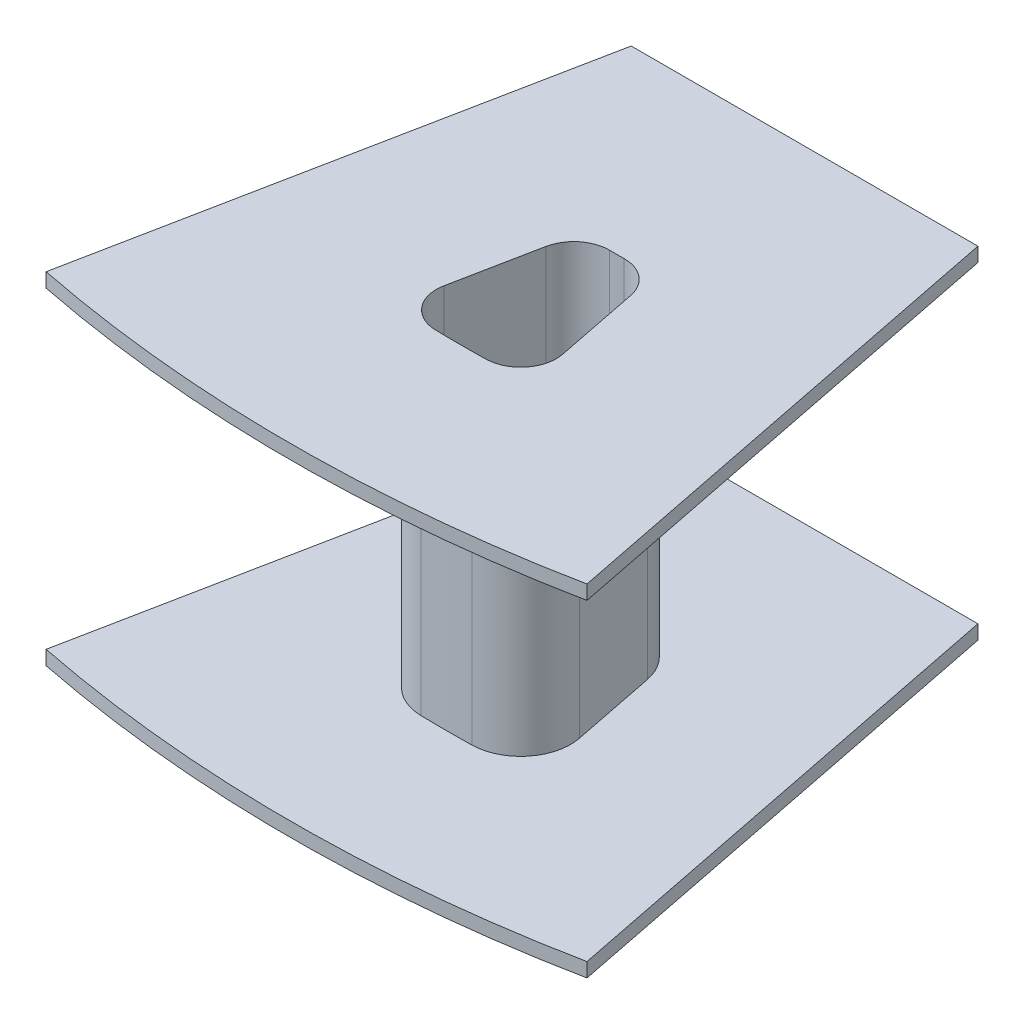
ISO-10303-21;
HEADER;
FILE_DESCRIPTION(('STEP AP214'),'2;1');
FILE_NAME('part.step','',(''),(''),'','','');
FILE_SCHEMA(('AUTOMOTIVE_DESIGN { 1 0 10303 214 1 1 1 1 }'));
ENDSEC;
DATA;
#1=APPLICATION_CONTEXT('core data for automotive mechanical design processes');
#2=APPLICATION_PROTOCOL_DEFINITION('international standard','automotive_design',2000,#1);
#3=PRODUCT_CONTEXT('',#1,'mechanical');
#4=PRODUCT('Part','Part','',(#3));
#5=PRODUCT_RELATED_PRODUCT_CATEGORY('part','',(#4));
#6=PRODUCT_DEFINITION_FORMATION('','',#4);
#7=PRODUCT_DEFINITION_CONTEXT('part definition',#1,'design');
#8=PRODUCT_DEFINITION('design','',#6,#7);
#9=PRODUCT_DEFINITION_SHAPE('','',#8);
#10=(LENGTH_UNIT() NAMED_UNIT(*) SI_UNIT(.MILLI.,.METRE.));
#11=(NAMED_UNIT(*) PLANE_ANGLE_UNIT() SI_UNIT($,.RADIAN.));
#12=(NAMED_UNIT(*) SI_UNIT($,.STERADIAN.) SOLID_ANGLE_UNIT());
#13=UNCERTAINTY_MEASURE_WITH_UNIT(LENGTH_MEASURE(1.E-05),#10,'distance_accuracy_value','');
#14=(GEOMETRIC_REPRESENTATION_CONTEXT(3) GLOBAL_UNCERTAINTY_ASSIGNED_CONTEXT((#13)) GLOBAL_UNIT_ASSIGNED_CONTEXT((#10,
#11,#12)) REPRESENTATION_CONTEXT('',''));
#15=CARTESIAN_POINT('',(0.,0.,0.));
#16=DIRECTION('',(0.,0.,1.));
#17=DIRECTION('',(1.,0.,0.));
#18=AXIS2_PLACEMENT_3D('',#15,#16,#17);
#19=CARTESIAN_POINT('',(0.,-8.,0.));
#20=DIRECTION('',(0.,1.,0.));
#21=DIRECTION('',(0.,0.,1.));
#22=AXIS2_PLACEMENT_3D('',#19,#20,#21);
#23=PLANE('',#22);
#24=CARTESIAN_POINT('',(0.,-8.,0.));
#25=DIRECTION('',(0.,-1.,0.));
#26=DIRECTION('',(0.,0.,1.));
#27=AXIS2_PLACEMENT_3D('',#24,#25,#26);
#28=CIRCLE('',#27,97.5);
#29=CARTESIAN_POINT('',(19.0213063965724,-8.,95.626564839315));
#30=VERTEX_POINT('',#29);
#31=CARTESIAN_POINT('',(-19.0213063965724,-8.,95.626564839315));
#32=VERTEX_POINT('',#31);
#33=EDGE_CURVE('E271',#30,#32,#28,.T.);
#34=ORIENTED_EDGE('',*,*,#33,.T.);
#35=DIRECTION('',(0.195090322016122,0.,-0.980785280403232));
#36=VECTOR('',#35,1.);
#37=CARTESIAN_POINT('',(-19.0213063965724,-8.,95.626564839315));
#38=LINE('',#37,#36);
#39=CARTESIAN_POINT('',(-12.1931451260081,-8.,61.2990800252019));
#40=VERTEX_POINT('',#39);
#41=EDGE_CURVE('E274',#32,#40,#38,.T.);
#42=ORIENTED_EDGE('',*,*,#41,.T.);
#43=DIRECTION('',(1.,0.,0.));
#44=VECTOR('',#43,1.);
#45=CARTESIAN_POINT('',(-12.1931451260081,-8.,61.2990800252019));
#46=LINE('',#45,#44);
#47=CARTESIAN_POINT('',(12.1931451260081,-8.,61.2990800252019));
#48=VERTEX_POINT('',#47);
#49=EDGE_CURVE('E277',#40,#48,#46,.T.);
#50=ORIENTED_EDGE('',*,*,#49,.T.);
#51=DIRECTION('',(0.195090322016122,0.,0.980785280403232));
#52=VECTOR('',#51,1.);
#53=CARTESIAN_POINT('',(19.0213063965724,-8.,95.626564839315));
#54=LINE('',#53,#52);
#55=EDGE_CURVE('E279',#48,#30,#54,.T.);
#56=ORIENTED_EDGE('',*,*,#55,.T.);
#57=EDGE_LOOP('',(#34,#42,#50,#56));
#58=FACE_BOUND('',#57,.T.);
#59=CARTESIAN_POINT('',(0.,-8.,0.));
#60=DIRECTION('',(0.,-1.,0.));
#61=DIRECTION('',(0.,0.,-1.));
#62=AXIS2_PLACEMENT_3D('',#59,#60,#61);
#63=CIRCLE('',#62,86.5);
#64=CARTESIAN_POINT('',(1.7947194017297,-8.,86.4813793961975));
#65=VERTEX_POINT('',#64);
#66=CARTESIAN_POINT('',(-1.79471940172972,-8.,86.4813793961975));
#67=VERTEX_POINT('',#66);
#68=EDGE_CURVE('E208',#65,#67,#63,.T.);
#69=ORIENTED_EDGE('',*,*,#68,.F.);
#70=CARTESIAN_POINT('',(1.72210069761349,-8.,82.9821328310335));
#71=DIRECTION('',(0.,-1.,0.));
#72=DIRECTION('',(0.,0.,-1.));
#73=AXIS2_PLACEMENT_3D('',#70,#71,#72);
#74=CIRCLE('',#73,3.5);
#75=CARTESIAN_POINT('',(5.1548491790248,-8.,82.299316703977));
#76=VERTEX_POINT('',#75);
#77=EDGE_CURVE('E251',#76,#65,#74,.T.);
#78=ORIENTED_EDGE('',*,*,#77,.F.);
#79=DIRECTION('',(0.195090322016121,0.,0.980785280403232));
#80=VECTOR('',#79,1.);
#81=CARTESIAN_POINT('',(3.96456366045838,-8.,76.3153473095823));
#82=LINE('',#81,#80);
#83=CARTESIAN_POINT('',(3.96456366045838,-8.,76.3153473095823));
#84=VERTEX_POINT('',#83);
#85=EDGE_CURVE('E248',#84,#76,#82,.T.);
#86=ORIENTED_EDGE('',*,*,#85,.F.);
#87=CARTESIAN_POINT('',(0.531815179047067,-8.,76.9981634366388));
#88=DIRECTION('',(0.,-1.,0.));
#89=DIRECTION('',(0.,0.,-1.));
#90=AXIS2_PLACEMENT_3D('',#87,#88,#89);
#91=CIRCLE('',#90,3.50000000000001);
#92=CARTESIAN_POINT('',(0.507641761817665,-8.,73.4982469167915));
#93=VERTEX_POINT('',#92);
#94=EDGE_CURVE('E245',#93,#84,#91,.T.);
#95=ORIENTED_EDGE('',*,*,#94,.F.);
#96=CARTESIAN_POINT('',(0.,-8.,0.));
#97=DIRECTION('',(0.,1.,0.));
#98=DIRECTION('',(0.,0.,-1.));
#99=AXIS2_PLACEMENT_3D('',#96,#97,#98);
#100=CIRCLE('',#99,73.5);
#101=CARTESIAN_POINT('',(-0.507641761817631,-8.,73.4982469167915));
#102=VERTEX_POINT('',#101);
#103=EDGE_CURVE('E242',#102,#93,#100,.T.);
#104=ORIENTED_EDGE('',*,*,#103,.F.);
#105=CARTESIAN_POINT('',(-0.531815179047067,-8.,76.9981634366388));
#106=DIRECTION('',(0.,-1.,0.));
#107=DIRECTION('',(0.,0.,-1.));
#108=AXIS2_PLACEMENT_3D('',#105,#106,#107);
#109=CIRCLE('',#108,3.50000000000001);
#110=CARTESIAN_POINT('',(-3.96456366045838,-8.,76.3153473095823));
#111=VERTEX_POINT('',#110);
#112=EDGE_CURVE('E239',#111,#102,#109,.T.);
#113=ORIENTED_EDGE('',*,*,#112,.F.);
#114=DIRECTION('',(0.195090322016122,0.,-0.980785280403232));
#115=VECTOR('',#114,1.);
#116=CARTESIAN_POINT('',(-5.1548491790248,-8.,82.299316703977));
#117=LINE('',#116,#115);
#118=CARTESIAN_POINT('',(-5.1548491790248,-8.,82.299316703977));
#119=VERTEX_POINT('',#118);
#120=EDGE_CURVE('E211',#119,#111,#117,.T.);
#121=ORIENTED_EDGE('',*,*,#120,.F.);
#122=CARTESIAN_POINT('',(-1.72210069761349,-8.,82.9821328310335));
#123=DIRECTION('',(0.,-1.,0.));
#124=DIRECTION('',(0.,0.,-1.));
#125=AXIS2_PLACEMENT_3D('',#122,#123,#124);
#126=CIRCLE('',#125,3.5);
#127=EDGE_CURVE('E205',#67,#119,#126,.T.);
#128=ORIENTED_EDGE('',*,*,#127,.F.);
#129=EDGE_LOOP('',(#69,#78,#86,#95,#104,#113,#121,#128));
#130=FACE_BOUND('',#129,.T.);
#131=ADVANCED_FACE('F33',(#58,#130),#23,.F.);
#132=CARTESIAN_POINT('',(0.,-7.,0.));
#133=DIRECTION('',(0.,1.,0.));
#134=DIRECTION('',(0.,0.,1.));
#135=AXIS2_PLACEMENT_3D('',#132,#133,#134);
#136=PLANE('',#135);
#137=CARTESIAN_POINT('',(0.,-7.,0.));
#138=DIRECTION('',(0.,-1.,0.));
#139=DIRECTION('',(0.,0.,-1.));
#140=AXIS2_PLACEMENT_3D('',#137,#138,#139);
#141=CIRCLE('',#140,85.5);
#142=CARTESIAN_POINT('',(1.77397120055366,-7.,85.4815946632935));
#143=VERTEX_POINT('',#142);
#144=CARTESIAN_POINT('',(-1.77397120055366,-7.,85.4815946632935));
#145=VERTEX_POINT('',#144);
#146=EDGE_CURVE('E680',#143,#145,#141,.T.);
#147=ORIENTED_EDGE('',*,*,#146,.T.);
#148=CARTESIAN_POINT('',(-1.72210069761349,-7.,82.9821328310335));
#149=DIRECTION('',(0.,-1.,0.));
#150=DIRECTION('',(0.,0.,-1.));
#151=AXIS2_PLACEMENT_3D('',#148,#149,#150);
#152=CIRCLE('',#151,2.5);
#153=CARTESIAN_POINT('',(-4.17406389862157,-7.,82.4944070259932));
#154=VERTEX_POINT('',#153);
#155=EDGE_CURVE('E694',#145,#154,#152,.T.);
#156=ORIENTED_EDGE('',*,*,#155,.T.);
#157=DIRECTION('',(0.195090322016122,0.,-0.980785280403232));
#158=VECTOR('',#157,1.);
#159=CARTESIAN_POINT('',(-4.17406389862157,-7.,82.4944070259932));
#160=LINE('',#159,#158);
#161=CARTESIAN_POINT('',(-2.98377838005515,-7.,76.5104376315985));
#162=VERTEX_POINT('',#161);
#163=EDGE_CURVE('E52',#154,#162,#160,.T.);
#164=ORIENTED_EDGE('',*,*,#163,.T.);
#165=CARTESIAN_POINT('',(-0.531815179047067,-7.,76.9981634366388));
#166=DIRECTION('',(0.,-1.,0.));
#167=DIRECTION('',(0.,0.,-1.));
#168=AXIS2_PLACEMENT_3D('',#165,#166,#167);
#169=CIRCLE('',#168,2.5);
#170=CARTESIAN_POINT('',(-0.51454845245458,-7.,74.4982230653193));
#171=VERTEX_POINT('',#170);
#172=EDGE_CURVE('E691',#162,#171,#169,.T.);
#173=ORIENTED_EDGE('',*,*,#172,.T.);
#174=CARTESIAN_POINT('',(0.,-7.,0.));
#175=DIRECTION('',(0.,1.,0.));
#176=DIRECTION('',(0.,0.,-1.));
#177=AXIS2_PLACEMENT_3D('',#174,#175,#176);
#178=CIRCLE('',#177,74.5);
#179=CARTESIAN_POINT('',(0.514548452454641,-7.,74.4982230653193));
#180=VERTEX_POINT('',#179);
#181=EDGE_CURVE('E329',#171,#180,#178,.T.);
#182=ORIENTED_EDGE('',*,*,#181,.T.);
#183=CARTESIAN_POINT('',(0.531815179047067,-7.,76.9981634366388));
#184=DIRECTION('',(0.,-1.,0.));
#185=DIRECTION('',(0.,0.,-1.));
#186=AXIS2_PLACEMENT_3D('',#183,#184,#185);
#187=CIRCLE('',#186,2.50000000000001);
#188=CARTESIAN_POINT('',(2.98377838005515,-7.,76.5104376315985));
#189=VERTEX_POINT('',#188);
#190=EDGE_CURVE('E687',#180,#189,#187,.T.);
#191=ORIENTED_EDGE('',*,*,#190,.T.);
#192=DIRECTION('',(0.195090322016121,0.,0.980785280403232));
#193=VECTOR('',#192,1.);
#194=CARTESIAN_POINT('',(2.98377838005515,-7.,76.5104376315985));
#195=LINE('',#194,#193);
#196=CARTESIAN_POINT('',(4.17406389862157,-7.,82.4944070259932));
#197=VERTEX_POINT('',#196);
#198=EDGE_CURVE('E684',#189,#197,#195,.T.);
#199=ORIENTED_EDGE('',*,*,#198,.T.);
#200=CARTESIAN_POINT('',(1.72210069761349,-7.,82.9821328310335));
#201=DIRECTION('',(0.,-1.,0.));
#202=DIRECTION('',(0.,0.,-1.));
#203=AXIS2_PLACEMENT_3D('',#200,#201,#202);
#204=CIRCLE('',#203,2.5);
#205=EDGE_CURVE('E339',#197,#143,#204,.T.);
#206=ORIENTED_EDGE('',*,*,#205,.T.);
#207=EDGE_LOOP('',(#147,#156,#164,#173,#182,#191,#199,#206));
#208=FACE_BOUND('',#207,.T.);
#209=CARTESIAN_POINT('',(0.,-7.,0.));
#210=DIRECTION('',(0.,-1.,0.));
#211=DIRECTION('',(0.,0.,1.));
#212=AXIS2_PLACEMENT_3D('',#209,#210,#211);
#213=CIRCLE('',#212,97.5);
#214=CARTESIAN_POINT('',(19.0213063965724,-7.,95.626564839315));
#215=VERTEX_POINT('',#214);
#216=CARTESIAN_POINT('',(-19.0213063965724,-7.,95.626564839315));
#217=VERTEX_POINT('',#216);
#218=EDGE_CURVE('E222',#215,#217,#213,.T.);
#219=ORIENTED_EDGE('',*,*,#218,.F.);
#220=DIRECTION('',(0.195090322016122,0.,0.980785280403232));
#221=VECTOR('',#220,1.);
#222=CARTESIAN_POINT('',(19.0213063965724,-7.,95.626564839315));
#223=LINE('',#222,#221);
#224=CARTESIAN_POINT('',(12.1931451260081,-7.,61.2990800252019));
#225=VERTEX_POINT('',#224);
#226=EDGE_CURVE('E275',#225,#215,#223,.T.);
#227=ORIENTED_EDGE('',*,*,#226,.F.);
#228=DIRECTION('',(1.,0.,0.));
#229=VECTOR('',#228,1.);
#230=CARTESIAN_POINT('',(-12.1931451260081,-7.,61.2990800252019));
#231=LINE('',#230,#229);
#232=CARTESIAN_POINT('',(-12.1931451260081,-7.,61.2990800252019));
#233=VERTEX_POINT('',#232);
#234=EDGE_CURVE('E286',#233,#225,#231,.T.);
#235=ORIENTED_EDGE('',*,*,#234,.F.);
#236=DIRECTION('',(0.195090322016122,0.,-0.980785280403232));
#237=VECTOR('',#236,1.);
#238=CARTESIAN_POINT('',(-19.0213063965724,-7.,95.626564839315));
#239=LINE('',#238,#237);
#240=EDGE_CURVE('E284',#217,#233,#239,.T.);
#241=ORIENTED_EDGE('',*,*,#240,.F.);
#242=EDGE_LOOP('',(#219,#227,#235,#241));
#243=FACE_BOUND('',#242,.T.);
#244=ADVANCED_FACE('F416',(#208,#243),#136,.T.);
#245=CARTESIAN_POINT('',(0.,-8.,0.));
#246=DIRECTION('',(0.,1.,0.));
#247=DIRECTION('',(0.,0.,1.));
#248=AXIS2_PLACEMENT_3D('',#245,#246,#247);
#249=CYLINDRICAL_SURFACE('',#248,97.5);
#250=ORIENTED_EDGE('',*,*,#218,.T.);
#251=DIRECTION('',(0.,1.,0.));
#252=VECTOR('',#251,1.);
#253=CARTESIAN_POINT('',(-19.0213063965724,-8.,95.626564839315));
#254=LINE('',#253,#252);
#255=EDGE_CURVE('E297',#32,#217,#254,.T.);
#256=ORIENTED_EDGE('',*,*,#255,.F.);
#257=ORIENTED_EDGE('',*,*,#33,.F.);
#258=DIRECTION('',(0.,1.,0.));
#259=VECTOR('',#258,1.);
#260=CARTESIAN_POINT('',(19.0213063965724,-8.,95.626564839315));
#261=LINE('',#260,#259);
#262=EDGE_CURVE('E281',#30,#215,#261,.T.);
#263=ORIENTED_EDGE('',*,*,#262,.T.);
#264=EDGE_LOOP('',(#250,#256,#257,#263));
#265=FACE_BOUND('',#264,.T.);
#266=ADVANCED_FACE('F35',(#265),#249,.T.);
#267=CARTESIAN_POINT('',(-19.0213063965724,-8.,95.626564839315));
#268=DIRECTION('',(0.980785280403232,0.,0.195090322016122));
#269=DIRECTION('',(0.195090322016122,0.,-0.980785280403232));
#270=AXIS2_PLACEMENT_3D('',#267,#268,#269);
#271=PLANE('',#270);
#272=ORIENTED_EDGE('',*,*,#240,.T.);
#273=DIRECTION('',(0.,1.,0.));
#274=VECTOR('',#273,1.);
#275=CARTESIAN_POINT('',(-12.1931451260081,-8.,61.2990800252019));
#276=LINE('',#275,#274);
#277=EDGE_CURVE('E294',#40,#233,#276,.T.);
#278=ORIENTED_EDGE('',*,*,#277,.F.);
#279=ORIENTED_EDGE('',*,*,#41,.F.);
#280=ORIENTED_EDGE('',*,*,#255,.T.);
#281=EDGE_LOOP('',(#272,#278,#279,#280));
#282=FACE_BOUND('',#281,.T.);
#283=ADVANCED_FACE('F432',(#282),#271,.F.);
#284=CARTESIAN_POINT('',(-12.1931451260081,-8.,61.2990800252019));
#285=DIRECTION('',(0.,0.,1.));
#286=DIRECTION('',(1.,0.,0.));
#287=AXIS2_PLACEMENT_3D('',#284,#285,#286);
#288=PLANE('',#287);
#289=ORIENTED_EDGE('',*,*,#234,.T.);
#290=DIRECTION('',(0.,1.,0.));
#291=VECTOR('',#290,1.);
#292=CARTESIAN_POINT('',(12.1931451260081,-8.,61.2990800252019));
#293=LINE('',#292,#291);
#294=EDGE_CURVE('E291',#48,#225,#293,.T.);
#295=ORIENTED_EDGE('',*,*,#294,.F.);
#296=ORIENTED_EDGE('',*,*,#49,.F.);
#297=ORIENTED_EDGE('',*,*,#277,.T.);
#298=EDGE_LOOP('',(#289,#295,#296,#297));
#299=FACE_BOUND('',#298,.T.);
#300=ADVANCED_FACE('F429',(#299),#288,.F.);
#301=CARTESIAN_POINT('',(19.0213063965724,-8.,95.626564839315));
#302=DIRECTION('',(-0.980785280403232,0.,0.195090322016122));
#303=DIRECTION('',(0.195090322016122,0.,0.980785280403232));
#304=AXIS2_PLACEMENT_3D('',#301,#302,#303);
#305=PLANE('',#304);
#306=ORIENTED_EDGE('',*,*,#226,.T.);
#307=ORIENTED_EDGE('',*,*,#262,.F.);
#308=ORIENTED_EDGE('',*,*,#55,.F.);
#309=ORIENTED_EDGE('',*,*,#294,.T.);
#310=EDGE_LOOP('',(#306,#307,#308,#309));
#311=FACE_BOUND('',#310,.T.);
#312=ADVANCED_FACE('F426',(#311),#305,.F.);
#313=CARTESIAN_POINT('',(0.,-30.,0.));
#314=DIRECTION('',(0.,1.,0.));
#315=DIRECTION('',(0.,0.,1.));
#316=AXIS2_PLACEMENT_3D('',#313,#314,#315);
#317=CYLINDRICAL_SURFACE('',#316,86.5);
#318=ORIENTED_EDGE('',*,*,#68,.T.);
#319=DIRECTION('',(0.,1.,0.));
#320=VECTOR('',#319,1.);
#321=CARTESIAN_POINT('',(-1.79471940172972,-30.,86.4813793961975));
#322=LINE('',#321,#320);
#323=CARTESIAN_POINT('',(-1.79471940172972,-30.,86.4813793961975));
#324=VERTEX_POINT('',#323);
#325=EDGE_CURVE('E216',#324,#67,#322,.T.);
#326=ORIENTED_EDGE('',*,*,#325,.F.);
#327=CARTESIAN_POINT('',(0.,-30.,0.));
#328=DIRECTION('',(0.,-1.,0.));
#329=DIRECTION('',(0.,0.,-1.));
#330=AXIS2_PLACEMENT_3D('',#327,#328,#329);
#331=CIRCLE('',#330,86.5);
#332=CARTESIAN_POINT('',(1.7947194017297,-30.,86.4813793961975));
#333=VERTEX_POINT('',#332);
#334=EDGE_CURVE('E253',#333,#324,#331,.T.);
#335=ORIENTED_EDGE('',*,*,#334,.F.);
#336=DIRECTION('',(0.,1.,0.));
#337=VECTOR('',#336,1.);
#338=CARTESIAN_POINT('',(1.7947194017297,-30.,86.4813793961975));
#339=LINE('',#338,#337);
#340=EDGE_CURVE('E228',#333,#65,#339,.T.);
#341=ORIENTED_EDGE('',*,*,#340,.T.);
#342=EDGE_LOOP('',(#318,#326,#335,#341));
#343=FACE_BOUND('',#342,.T.);
#344=ADVANCED_FACE('F226',(#343),#317,.T.);
#345=CARTESIAN_POINT('',(-1.72210069761349,-30.,82.9821328310335));
#346=DIRECTION('',(0.,1.,0.));
#347=DIRECTION('',(0.,0.,1.));
#348=AXIS2_PLACEMENT_3D('',#345,#346,#347);
#349=CYLINDRICAL_SURFACE('',#348,3.5);
#350=ORIENTED_EDGE('',*,*,#127,.T.);
#351=DIRECTION('',(0.,1.,0.));
#352=VECTOR('',#351,1.);
#353=CARTESIAN_POINT('',(-5.15484917902481,-30.,82.299316703977));
#354=LINE('',#353,#352);
#355=CARTESIAN_POINT('',(-5.15484917902481,-30.,82.299316703977));
#356=VERTEX_POINT('',#355);
#357=EDGE_CURVE('E223',#356,#119,#354,.T.);
#358=ORIENTED_EDGE('',*,*,#357,.F.);
#359=CARTESIAN_POINT('',(-1.72210069761349,-30.,82.9821328310335));
#360=DIRECTION('',(0.,-1.,0.));
#361=DIRECTION('',(0.,0.,-1.));
#362=AXIS2_PLACEMENT_3D('',#359,#360,#361);
#363=CIRCLE('',#362,3.5);
#364=EDGE_CURVE('E219',#324,#356,#363,.T.);
#365=ORIENTED_EDGE('',*,*,#364,.F.);
#366=ORIENTED_EDGE('',*,*,#325,.T.);
#367=EDGE_LOOP('',(#350,#358,#365,#366));
#368=FACE_BOUND('',#367,.T.);
#369=ADVANCED_FACE('F217',(#368),#349,.T.);
#370=CARTESIAN_POINT('',(-5.1548491790248,-30.,82.299316703977));
#371=DIRECTION('',(0.980785280403232,0.,0.195090322016122));
#372=DIRECTION('',(0.195090322016122,0.,-0.980785280403232));
#373=AXIS2_PLACEMENT_3D('',#370,#371,#372);
#374=PLANE('',#373);
#375=ORIENTED_EDGE('',*,*,#120,.T.);
#376=DIRECTION('',(0.,1.,0.));
#377=VECTOR('',#376,1.);
#378=CARTESIAN_POINT('',(-3.96456366045838,-30.,76.3153473095823));
#379=LINE('',#378,#377);
#380=CARTESIAN_POINT('',(-3.96456366045838,-30.,76.3153473095823));
#381=VERTEX_POINT('',#380);
#382=EDGE_CURVE('E267',#381,#111,#379,.T.);
#383=ORIENTED_EDGE('',*,*,#382,.F.);
#384=DIRECTION('',(0.195090322016122,0.,-0.980785280403232));
#385=VECTOR('',#384,1.);
#386=CARTESIAN_POINT('',(-5.1548491790248,-30.,82.299316703977));
#387=LINE('',#386,#385);
#388=EDGE_CURVE('E372',#356,#381,#387,.T.);
#389=ORIENTED_EDGE('',*,*,#388,.F.);
#390=ORIENTED_EDGE('',*,*,#357,.T.);
#391=EDGE_LOOP('',(#375,#383,#389,#390));
#392=FACE_BOUND('',#391,.T.);
#393=ADVANCED_FACE('F405',(#392),#374,.F.);
#394=CARTESIAN_POINT('',(-0.531815179047067,-30.,76.9981634366388));
#395=DIRECTION('',(0.,1.,0.));
#396=DIRECTION('',(0.,0.,1.));
#397=AXIS2_PLACEMENT_3D('',#394,#395,#396);
#398=CYLINDRICAL_SURFACE('',#397,3.50000000000001);
#399=ORIENTED_EDGE('',*,*,#112,.T.);
#400=DIRECTION('',(0.,1.,0.));
#401=VECTOR('',#400,1.);
#402=CARTESIAN_POINT('',(-0.507641761817631,-30.,73.4982469167915));
#403=LINE('',#402,#401);
#404=CARTESIAN_POINT('',(-0.507641761817631,-30.,73.4982469167915));
#405=VERTEX_POINT('',#404);
#406=EDGE_CURVE('E264',#405,#102,#403,.T.);
#407=ORIENTED_EDGE('',*,*,#406,.F.);
#408=CARTESIAN_POINT('',(-0.531815179047067,-30.,76.9981634366388));
#409=DIRECTION('',(0.,-1.,0.));
#410=DIRECTION('',(0.,0.,-1.));
#411=AXIS2_PLACEMENT_3D('',#408,#409,#410);
#412=CIRCLE('',#411,3.50000000000001);
#413=EDGE_CURVE('E375',#381,#405,#412,.T.);
#414=ORIENTED_EDGE('',*,*,#413,.F.);
#415=ORIENTED_EDGE('',*,*,#382,.T.);
#416=EDGE_LOOP('',(#399,#407,#414,#415));
#417=FACE_BOUND('',#416,.T.);
#418=ADVANCED_FACE('F403',(#417),#398,.T.);
#419=CARTESIAN_POINT('',(0.,-30.,0.));
#420=DIRECTION('',(0.,1.,0.));
#421=DIRECTION('',(0.,0.,1.));
#422=AXIS2_PLACEMENT_3D('',#419,#420,#421);
#423=CYLINDRICAL_SURFACE('',#422,73.5);
#424=ORIENTED_EDGE('',*,*,#103,.T.);
#425=DIRECTION('',(0.,1.,0.));
#426=VECTOR('',#425,1.);
#427=CARTESIAN_POINT('',(0.507641761817665,-30.,73.4982469167915));
#428=LINE('',#427,#426);
#429=CARTESIAN_POINT('',(0.507641761817665,-30.,73.4982469167915));
#430=VERTEX_POINT('',#429);
#431=EDGE_CURVE('E261',#430,#93,#428,.T.);
#432=ORIENTED_EDGE('',*,*,#431,.F.);
#433=CARTESIAN_POINT('',(0.,-30.,0.));
#434=DIRECTION('',(0.,1.,0.));
#435=DIRECTION('',(0.,0.,-1.));
#436=AXIS2_PLACEMENT_3D('',#433,#434,#435);
#437=CIRCLE('',#436,73.5);
#438=EDGE_CURVE('E378',#405,#430,#437,.T.);
#439=ORIENTED_EDGE('',*,*,#438,.F.);
#440=ORIENTED_EDGE('',*,*,#406,.T.);
#441=EDGE_LOOP('',(#424,#432,#439,#440));
#442=FACE_BOUND('',#441,.T.);
#443=ADVANCED_FACE('F399',(#442),#423,.F.);
#444=CARTESIAN_POINT('',(0.531815179047067,-30.,76.9981634366388));
#445=DIRECTION('',(0.,1.,0.));
#446=DIRECTION('',(0.,0.,1.));
#447=AXIS2_PLACEMENT_3D('',#444,#445,#446);
#448=CYLINDRICAL_SURFACE('',#447,3.50000000000001);
#449=ORIENTED_EDGE('',*,*,#94,.T.);
#450=DIRECTION('',(0.,1.,0.));
#451=VECTOR('',#450,1.);
#452=CARTESIAN_POINT('',(3.96456366045838,-30.,76.3153473095823));
#453=LINE('',#452,#451);
#454=CARTESIAN_POINT('',(3.96456366045838,-30.,76.3153473095823));
#455=VERTEX_POINT('',#454);
#456=EDGE_CURVE('E258',#455,#84,#453,.T.);
#457=ORIENTED_EDGE('',*,*,#456,.F.);
#458=CARTESIAN_POINT('',(0.531815179047067,-30.,76.9981634366388));
#459=DIRECTION('',(0.,-1.,0.));
#460=DIRECTION('',(0.,0.,-1.));
#461=AXIS2_PLACEMENT_3D('',#458,#459,#460);
#462=CIRCLE('',#461,3.50000000000001);
#463=EDGE_CURVE('E381',#430,#455,#462,.T.);
#464=ORIENTED_EDGE('',*,*,#463,.F.);
#465=ORIENTED_EDGE('',*,*,#431,.T.);
#466=EDGE_LOOP('',(#449,#457,#464,#465));
#467=FACE_BOUND('',#466,.T.);
#468=ADVANCED_FACE('F397',(#467),#448,.T.);
#469=CARTESIAN_POINT('',(3.96456366045838,-30.,76.3153473095823));
#470=DIRECTION('',(-0.980785280403232,0.,0.195090322016121));
#471=DIRECTION('',(0.195090322016121,0.,0.980785280403232));
#472=AXIS2_PLACEMENT_3D('',#469,#470,#471);
#473=PLANE('',#472);
#474=ORIENTED_EDGE('',*,*,#85,.T.);
#475=DIRECTION('',(0.,1.,0.));
#476=VECTOR('',#475,1.);
#477=CARTESIAN_POINT('',(5.1548491790248,-30.,82.299316703977));
#478=LINE('',#477,#476);
#479=CARTESIAN_POINT('',(5.1548491790248,-30.,82.299316703977));
#480=VERTEX_POINT('',#479);
#481=EDGE_CURVE('E255',#480,#76,#478,.T.);
#482=ORIENTED_EDGE('',*,*,#481,.F.);
#483=DIRECTION('',(0.195090322016121,0.,0.980785280403232));
#484=VECTOR('',#483,1.);
#485=CARTESIAN_POINT('',(3.96456366045838,-30.,76.3153473095823));
#486=LINE('',#485,#484);
#487=EDGE_CURVE('E383',#455,#480,#486,.T.);
#488=ORIENTED_EDGE('',*,*,#487,.F.);
#489=ORIENTED_EDGE('',*,*,#456,.T.);
#490=EDGE_LOOP('',(#474,#482,#488,#489));
#491=FACE_BOUND('',#490,.T.);
#492=ADVANCED_FACE('F394',(#491),#473,.F.);
#493=CARTESIAN_POINT('',(1.72210069761349,-30.,82.9821328310335));
#494=DIRECTION('',(0.,1.,0.));
#495=DIRECTION('',(0.,0.,1.));
#496=AXIS2_PLACEMENT_3D('',#493,#494,#495);
#497=CYLINDRICAL_SURFACE('',#496,3.5);
#498=ORIENTED_EDGE('',*,*,#77,.T.);
#499=ORIENTED_EDGE('',*,*,#340,.F.);
#500=CARTESIAN_POINT('',(1.72210069761349,-30.,82.9821328310335));
#501=DIRECTION('',(0.,-1.,0.));
#502=DIRECTION('',(0.,0.,-1.));
#503=AXIS2_PLACEMENT_3D('',#500,#501,#502);
#504=CIRCLE('',#503,3.5);
#505=EDGE_CURVE('E235',#480,#333,#504,.T.);
#506=ORIENTED_EDGE('',*,*,#505,.F.);
#507=ORIENTED_EDGE('',*,*,#481,.T.);
#508=EDGE_LOOP('',(#498,#499,#506,#507));
#509=FACE_BOUND('',#508,.T.);
#510=ADVANCED_FACE('F392',(#509),#497,.T.);
#511=CARTESIAN_POINT('',(0.,-31.,0.));
#512=DIRECTION('',(0.,-1.,0.));
#513=DIRECTION('',(0.,0.,-1.));
#514=AXIS2_PLACEMENT_3D('',#511,#512,#513);
#515=PLANE('',#514);
#516=CARTESIAN_POINT('',(0.,-31.,0.));
#517=DIRECTION('',(0.,-1.,0.));
#518=DIRECTION('',(0.,0.,-1.));
#519=AXIS2_PLACEMENT_3D('',#516,#517,#518);
#520=CIRCLE('',#519,85.5);
#521=CARTESIAN_POINT('',(1.77397120055366,-31.,85.4815946632935));
#522=VERTEX_POINT('',#521);
#523=CARTESIAN_POINT('',(-1.77397120055366,-31.,85.4815946632935));
#524=VERTEX_POINT('',#523);
#525=EDGE_CURVE('E11',#522,#524,#520,.T.);
#526=ORIENTED_EDGE('',*,*,#525,.F.);
#527=CARTESIAN_POINT('',(1.72210069761349,-31.,82.9821328310335));
#528=DIRECTION('',(0.,-1.,0.));
#529=DIRECTION('',(0.,0.,-1.));
#530=AXIS2_PLACEMENT_3D('',#527,#528,#529);
#531=CIRCLE('',#530,2.5);
#532=CARTESIAN_POINT('',(4.17406389862157,-31.,82.4944070259932));
#533=VERTEX_POINT('',#532);
#534=EDGE_CURVE('E43',#533,#522,#531,.T.);
#535=ORIENTED_EDGE('',*,*,#534,.F.);
#536=DIRECTION('',(-0.195090322016121,0.,-0.980785280403232));
#537=VECTOR('',#536,1.);
#538=CARTESIAN_POINT('',(2.98377838005515,-31.,76.5104376315985));
#539=LINE('',#538,#537);
#540=CARTESIAN_POINT('',(2.98377838005515,-31.,76.5104376315985));
#541=VERTEX_POINT('',#540);
#542=EDGE_CURVE('E37',#541,#533,#539,.F.);
#543=ORIENTED_EDGE('',*,*,#542,.F.);
#544=CARTESIAN_POINT('',(0.531815179047067,-31.,76.9981634366388));
#545=DIRECTION('',(0.,-1.,0.));
#546=DIRECTION('',(0.,0.,-1.));
#547=AXIS2_PLACEMENT_3D('',#544,#545,#546);
#548=CIRCLE('',#547,2.50000000000001);
#549=CARTESIAN_POINT('',(0.514548452454641,-31.,74.4982230653193));
#550=VERTEX_POINT('',#549);
#551=EDGE_CURVE('E70',#550,#541,#548,.T.);
#552=ORIENTED_EDGE('',*,*,#551,.F.);
#553=CARTESIAN_POINT('',(0.,-31.,0.));
#554=DIRECTION('',(0.,-1.,0.));
#555=DIRECTION('',(0.,0.,-1.));
#556=AXIS2_PLACEMENT_3D('',#553,#554,#555);
#557=CIRCLE('',#556,74.5);
#558=CARTESIAN_POINT('',(-0.51454845245458,-31.,74.4982230653193));
#559=VERTEX_POINT('',#558);
#560=EDGE_CURVE('E305',#559,#550,#557,.F.);
#561=ORIENTED_EDGE('',*,*,#560,.F.);
#562=CARTESIAN_POINT('',(-0.531815179047067,-31.,76.9981634366388));
#563=DIRECTION('',(0.,-1.,0.));
#564=DIRECTION('',(0.,0.,-1.));
#565=AXIS2_PLACEMENT_3D('',#562,#563,#564);
#566=CIRCLE('',#565,2.5);
#567=CARTESIAN_POINT('',(-2.98377838005515,-31.,76.5104376315985));
#568=VERTEX_POINT('',#567);
#569=EDGE_CURVE('E303',#568,#559,#566,.T.);
#570=ORIENTED_EDGE('',*,*,#569,.F.);
#571=DIRECTION('',(-0.195090322016122,0.,0.980785280403232));
#572=VECTOR('',#571,1.);
#573=CARTESIAN_POINT('',(-4.17406389862157,-31.,82.4944070259932));
#574=LINE('',#573,#572);
#575=CARTESIAN_POINT('',(-4.17406389862157,-31.,82.4944070259932));
#576=VERTEX_POINT('',#575);
#577=EDGE_CURVE('E302',#576,#568,#574,.F.);
#578=ORIENTED_EDGE('',*,*,#577,.F.);
#579=CARTESIAN_POINT('',(-1.72210069761349,-31.,82.9821328310335));
#580=DIRECTION('',(0.,-1.,0.));
#581=DIRECTION('',(0.,0.,-1.));
#582=AXIS2_PLACEMENT_3D('',#579,#580,#581);
#583=CIRCLE('',#582,2.5);
#584=EDGE_CURVE('E300',#524,#576,#583,.T.);
#585=ORIENTED_EDGE('',*,*,#584,.F.);
#586=EDGE_LOOP('',(#526,#535,#543,#552,#561,#570,#578,#585));
#587=FACE_BOUND('',#586,.T.);
#588=CARTESIAN_POINT('',(0.,-31.,0.));
#589=DIRECTION('',(0.,-1.,0.));
#590=DIRECTION('',(0.,0.,-1.));
#591=AXIS2_PLACEMENT_3D('',#588,#589,#590);
#592=CIRCLE('',#591,97.5);
#593=CARTESIAN_POINT('',(19.0213063965724,-31.,95.626564839315));
#594=VERTEX_POINT('',#593);
#595=CARTESIAN_POINT('',(-19.0213063965724,-31.,95.626564839315));
#596=VERTEX_POINT('',#595);
#597=EDGE_CURVE('E344',#594,#596,#592,.T.);
#598=ORIENTED_EDGE('',*,*,#597,.T.);
#599=DIRECTION('',(0.195090322016121,0.,-0.980785280403232));
#600=VECTOR('',#599,1.);
#601=CARTESIAN_POINT('',(-19.0213063965724,-31.,95.626564839315));
#602=LINE('',#601,#600);
#603=CARTESIAN_POINT('',(-12.1931451260081,-31.,61.2990800252019));
#604=VERTEX_POINT('',#603);
#605=EDGE_CURVE('E347',#596,#604,#602,.T.);
#606=ORIENTED_EDGE('',*,*,#605,.T.);
#607=DIRECTION('',(1.,0.,0.));
#608=VECTOR('',#607,1.);
#609=CARTESIAN_POINT('',(-12.1931451260081,-31.,61.2990800252019));
#610=LINE('',#609,#608);
#611=CARTESIAN_POINT('',(12.1931451260081,-31.,61.2990800252019));
#612=VERTEX_POINT('',#611);
#613=EDGE_CURVE('E350',#604,#612,#610,.T.);
#614=ORIENTED_EDGE('',*,*,#613,.T.);
#615=DIRECTION('',(0.195090322016122,0.,0.980785280403232));
#616=VECTOR('',#615,1.);
#617=CARTESIAN_POINT('',(12.1931451260081,-31.,61.2990800252019));
#618=LINE('',#617,#616);
#619=EDGE_CURVE('E352',#612,#594,#618,.T.);
#620=ORIENTED_EDGE('',*,*,#619,.T.);
#621=EDGE_LOOP('',(#598,#606,#614,#620));
#622=FACE_BOUND('',#621,.T.);
#623=ADVANCED_FACE('F319',(#587,#622),#515,.T.);
#624=CARTESIAN_POINT('',(0.,-30.,0.));
#625=DIRECTION('',(0.,-1.,0.));
#626=DIRECTION('',(0.,0.,-1.));
#627=AXIS2_PLACEMENT_3D('',#624,#625,#626);
#628=PLANE('',#627);
#629=ORIENTED_EDGE('',*,*,#505,.T.);
#630=ORIENTED_EDGE('',*,*,#334,.T.);
#631=ORIENTED_EDGE('',*,*,#364,.T.);
#632=ORIENTED_EDGE('',*,*,#388,.T.);
#633=ORIENTED_EDGE('',*,*,#413,.T.);
#634=ORIENTED_EDGE('',*,*,#438,.T.);
#635=ORIENTED_EDGE('',*,*,#463,.T.);
#636=ORIENTED_EDGE('',*,*,#487,.T.);
#637=EDGE_LOOP('',(#629,#630,#631,#632,#633,#634,#635,#636));
#638=FACE_BOUND('',#637,.T.);
#639=CARTESIAN_POINT('',(0.,-30.,0.));
#640=DIRECTION('',(0.,-1.,0.));
#641=DIRECTION('',(0.,0.,-1.));
#642=AXIS2_PLACEMENT_3D('',#639,#640,#641);
#643=CIRCLE('',#642,97.5);
#644=CARTESIAN_POINT('',(19.0213063965724,-30.,95.626564839315));
#645=VERTEX_POINT('',#644);
#646=CARTESIAN_POINT('',(-19.0213063965724,-30.,95.626564839315));
#647=VERTEX_POINT('',#646);
#648=EDGE_CURVE('E355',#645,#647,#643,.T.);
#649=ORIENTED_EDGE('',*,*,#648,.F.);
#650=DIRECTION('',(0.195090322016122,0.,0.980785280403232));
#651=VECTOR('',#650,1.);
#652=CARTESIAN_POINT('',(12.1931451260081,-30.,61.2990800252019));
#653=LINE('',#652,#651);
#654=CARTESIAN_POINT('',(12.1931451260081,-30.,61.2990800252019));
#655=VERTEX_POINT('',#654);
#656=EDGE_CURVE('E348',#655,#645,#653,.T.);
#657=ORIENTED_EDGE('',*,*,#656,.F.);
#658=DIRECTION('',(1.,0.,0.));
#659=VECTOR('',#658,1.);
#660=CARTESIAN_POINT('',(-12.1931451260081,-30.,61.2990800252019));
#661=LINE('',#660,#659);
#662=CARTESIAN_POINT('',(-12.1931451260081,-30.,61.2990800252019));
#663=VERTEX_POINT('',#662);
#664=EDGE_CURVE('E360',#663,#655,#661,.T.);
#665=ORIENTED_EDGE('',*,*,#664,.F.);
#666=DIRECTION('',(0.195090322016121,0.,-0.980785280403232));
#667=VECTOR('',#666,1.);
#668=CARTESIAN_POINT('',(-19.0213063965724,-30.,95.626564839315));
#669=LINE('',#668,#667);
#670=EDGE_CURVE('E358',#647,#663,#669,.T.);
#671=ORIENTED_EDGE('',*,*,#670,.F.);
#672=EDGE_LOOP('',(#649,#657,#665,#671));
#673=FACE_BOUND('',#672,.T.);
#674=ADVANCED_FACE('F389',(#638,#673),#628,.F.);
#675=CARTESIAN_POINT('',(0.,-31.,0.));
#676=DIRECTION('',(0.,1.,0.));
#677=DIRECTION('',(0.,0.,1.));
#678=AXIS2_PLACEMENT_3D('',#675,#676,#677);
#679=CYLINDRICAL_SURFACE('',#678,97.5);
#680=ORIENTED_EDGE('',*,*,#648,.T.);
#681=DIRECTION('',(0.,1.,0.));
#682=VECTOR('',#681,1.);
#683=CARTESIAN_POINT('',(-19.0213063965724,-31.,95.626564839315));
#684=LINE('',#683,#682);
#685=EDGE_CURVE('E229',#596,#647,#684,.T.);
#686=ORIENTED_EDGE('',*,*,#685,.F.);
#687=ORIENTED_EDGE('',*,*,#597,.F.);
#688=DIRECTION('',(0.,1.,0.));
#689=VECTOR('',#688,1.);
#690=CARTESIAN_POINT('',(19.0213063965724,-31.,95.626564839315));
#691=LINE('',#690,#689);
#692=EDGE_CURVE('E354',#594,#645,#691,.T.);
#693=ORIENTED_EDGE('',*,*,#692,.T.);
#694=EDGE_LOOP('',(#680,#686,#687,#693));
#695=FACE_BOUND('',#694,.T.);
#696=ADVANCED_FACE('F553',(#695),#679,.T.);
#697=CARTESIAN_POINT('',(-19.0213063965724,-31.,95.626564839315));
#698=DIRECTION('',(0.980785280403232,0.,0.195090322016121));
#699=DIRECTION('',(0.195090322016121,0.,-0.980785280403232));
#700=AXIS2_PLACEMENT_3D('',#697,#698,#699);
#701=PLANE('',#700);
#702=ORIENTED_EDGE('',*,*,#670,.T.);
#703=DIRECTION('',(0.,1.,0.));
#704=VECTOR('',#703,1.);
#705=CARTESIAN_POINT('',(-12.1931451260081,-31.,61.2990800252019));
#706=LINE('',#705,#704);
#707=EDGE_CURVE('E232',#604,#663,#706,.T.);
#708=ORIENTED_EDGE('',*,*,#707,.F.);
#709=ORIENTED_EDGE('',*,*,#605,.F.);
#710=ORIENTED_EDGE('',*,*,#685,.T.);
#711=EDGE_LOOP('',(#702,#708,#709,#710));
#712=FACE_BOUND('',#711,.T.);
#713=ADVANCED_FACE('F559',(#712),#701,.F.);
#714=CARTESIAN_POINT('',(-12.1931451260081,-31.,61.2990800252019));
#715=DIRECTION('',(0.,0.,1.));
#716=DIRECTION('',(1.,0.,0.));
#717=AXIS2_PLACEMENT_3D('',#714,#715,#716);
#718=PLANE('',#717);
#719=ORIENTED_EDGE('',*,*,#664,.T.);
#720=DIRECTION('',(0.,1.,0.));
#721=VECTOR('',#720,1.);
#722=CARTESIAN_POINT('',(12.1931451260081,-31.,61.2990800252019));
#723=LINE('',#722,#721);
#724=EDGE_CURVE('E365',#612,#655,#723,.T.);
#725=ORIENTED_EDGE('',*,*,#724,.F.);
#726=ORIENTED_EDGE('',*,*,#613,.F.);
#727=ORIENTED_EDGE('',*,*,#707,.T.);
#728=EDGE_LOOP('',(#719,#725,#726,#727));
#729=FACE_BOUND('',#728,.T.);
#730=ADVANCED_FACE('F555',(#729),#718,.F.);
#731=CARTESIAN_POINT('',(12.1931451260081,-31.,61.2990800252019));
#732=DIRECTION('',(-0.980785280403232,0.,0.195090322016122));
#733=DIRECTION('',(0.195090322016122,0.,0.980785280403232));
#734=AXIS2_PLACEMENT_3D('',#731,#732,#733);
#735=PLANE('',#734);
#736=ORIENTED_EDGE('',*,*,#656,.T.);
#737=ORIENTED_EDGE('',*,*,#692,.F.);
#738=ORIENTED_EDGE('',*,*,#619,.F.);
#739=ORIENTED_EDGE('',*,*,#724,.T.);
#740=EDGE_LOOP('',(#736,#737,#738,#739));
#741=FACE_BOUND('',#740,.T.);
#742=ADVANCED_FACE('F484',(#741),#735,.F.);
#743=CARTESIAN_POINT('',(0.,-7.,0.));
#744=DIRECTION('',(0.,-1.,0.));
#745=DIRECTION('',(0.,0.,-1.));
#746=AXIS2_PLACEMENT_3D('',#743,#744,#745);
#747=CYLINDRICAL_SURFACE('',#746,85.5);
#748=ORIENTED_EDGE('',*,*,#525,.T.);
#749=DIRECTION('',(0.,-1.,0.));
#750=VECTOR('',#749,1.);
#751=CARTESIAN_POINT('',(-1.77397120055366,-7.,85.4815946632935));
#752=LINE('',#751,#750);
#753=EDGE_CURVE('E85',#145,#524,#752,.T.);
#754=ORIENTED_EDGE('',*,*,#753,.F.);
#755=ORIENTED_EDGE('',*,*,#146,.F.);
#756=DIRECTION('',(0.,-1.,0.));
#757=VECTOR('',#756,1.);
#758=CARTESIAN_POINT('',(1.77397120055366,-7.,85.4815946632935));
#759=LINE('',#758,#757);
#760=EDGE_CURVE('E342',#143,#522,#759,.T.);
#761=ORIENTED_EDGE('',*,*,#760,.T.);
#762=EDGE_LOOP('',(#748,#754,#755,#761));
#763=FACE_BOUND('',#762,.T.);
#764=ADVANCED_FACE('F478',(#763),#747,.F.);
#765=CARTESIAN_POINT('',(1.72210069761349,-7.,82.9821328310335));
#766=DIRECTION('',(0.,-1.,0.));
#767=DIRECTION('',(0.,0.,-1.));
#768=AXIS2_PLACEMENT_3D('',#765,#766,#767);
#769=CYLINDRICAL_SURFACE('',#768,2.5);
#770=ORIENTED_EDGE('',*,*,#534,.T.);
#771=ORIENTED_EDGE('',*,*,#760,.F.);
#772=ORIENTED_EDGE('',*,*,#205,.F.);
#773=DIRECTION('',(0.,-1.,0.));
#774=VECTOR('',#773,1.);
#775=CARTESIAN_POINT('',(4.17406389862157,-7.,82.4944070259932));
#776=LINE('',#775,#774);
#777=EDGE_CURVE('E78',#197,#533,#776,.T.);
#778=ORIENTED_EDGE('',*,*,#777,.T.);
#779=EDGE_LOOP('',(#770,#771,#772,#778));
#780=FACE_BOUND('',#779,.T.);
#781=ADVANCED_FACE('F483',(#780),#769,.F.);
#782=CARTESIAN_POINT('',(2.98377838005515,-7.,76.5104376315985));
#783=DIRECTION('',(0.980785280403232,0.,-0.195090322016121));
#784=DIRECTION('',(-0.195090322016121,0.,-0.980785280403232));
#785=AXIS2_PLACEMENT_3D('',#782,#783,#784);
#786=PLANE('',#785);
#787=ORIENTED_EDGE('',*,*,#542,.T.);
#788=ORIENTED_EDGE('',*,*,#777,.F.);
#789=ORIENTED_EDGE('',*,*,#198,.F.);
#790=DIRECTION('',(0.,-1.,0.));
#791=VECTOR('',#790,1.);
#792=CARTESIAN_POINT('',(2.98377838005515,-7.,76.5104376315985));
#793=LINE('',#792,#791);
#794=EDGE_CURVE('E333',#189,#541,#793,.T.);
#795=ORIENTED_EDGE('',*,*,#794,.T.);
#796=EDGE_LOOP('',(#787,#788,#789,#795));
#797=FACE_BOUND('',#796,.T.);
#798=ADVANCED_FACE('F495',(#797),#786,.F.);
#799=CARTESIAN_POINT('',(0.531815179047067,-7.,76.9981634366388));
#800=DIRECTION('',(0.,-1.,0.));
#801=DIRECTION('',(0.,0.,-1.));
#802=AXIS2_PLACEMENT_3D('',#799,#800,#801);
#803=CYLINDRICAL_SURFACE('',#802,2.50000000000001);
#804=ORIENTED_EDGE('',*,*,#551,.T.);
#805=ORIENTED_EDGE('',*,*,#794,.F.);
#806=ORIENTED_EDGE('',*,*,#190,.F.);
#807=DIRECTION('',(0.,-1.,0.));
#808=VECTOR('',#807,1.);
#809=CARTESIAN_POINT('',(0.514548452454641,-7.,74.4982230653193));
#810=LINE('',#809,#808);
#811=EDGE_CURVE('E331',#180,#550,#810,.T.);
#812=ORIENTED_EDGE('',*,*,#811,.T.);
#813=EDGE_LOOP('',(#804,#805,#806,#812));
#814=FACE_BOUND('',#813,.T.);
#815=ADVANCED_FACE('F504',(#814),#803,.F.);
#816=CARTESIAN_POINT('',(0.,-7.,0.));
#817=DIRECTION('',(0.,-1.,0.));
#818=DIRECTION('',(0.,0.,-1.));
#819=AXIS2_PLACEMENT_3D('',#816,#817,#818);
#820=CYLINDRICAL_SURFACE('',#819,74.5);
#821=ORIENTED_EDGE('',*,*,#560,.T.);
#822=ORIENTED_EDGE('',*,*,#811,.F.);
#823=ORIENTED_EDGE('',*,*,#181,.F.);
#824=DIRECTION('',(0.,-1.,0.));
#825=VECTOR('',#824,1.);
#826=CARTESIAN_POINT('',(-0.51454845245458,-7.,74.4982230653193));
#827=LINE('',#826,#825);
#828=EDGE_CURVE('E324',#171,#559,#827,.T.);
#829=ORIENTED_EDGE('',*,*,#828,.T.);
#830=EDGE_LOOP('',(#821,#822,#823,#829));
#831=FACE_BOUND('',#830,.T.);
#832=ADVANCED_FACE('F327',(#831),#820,.T.);
#833=CARTESIAN_POINT('',(-0.531815179047067,-7.,76.9981634366388));
#834=DIRECTION('',(0.,-1.,0.));
#835=DIRECTION('',(0.,0.,-1.));
#836=AXIS2_PLACEMENT_3D('',#833,#834,#835);
#837=CYLINDRICAL_SURFACE('',#836,2.5);
#838=ORIENTED_EDGE('',*,*,#569,.T.);
#839=ORIENTED_EDGE('',*,*,#828,.F.);
#840=ORIENTED_EDGE('',*,*,#172,.F.);
#841=DIRECTION('',(0.,-1.,0.));
#842=VECTOR('',#841,1.);
#843=CARTESIAN_POINT('',(-2.98377838005515,-7.,76.5104376315985));
#844=LINE('',#843,#842);
#845=EDGE_CURVE('E312',#162,#568,#844,.T.);
#846=ORIENTED_EDGE('',*,*,#845,.T.);
#847=EDGE_LOOP('',(#838,#839,#840,#846));
#848=FACE_BOUND('',#847,.T.);
#849=ADVANCED_FACE('F323',(#848),#837,.F.);
#850=CARTESIAN_POINT('',(-4.17406389862157,-7.,82.4944070259932));
#851=DIRECTION('',(-0.980785280403232,0.,-0.195090322016122));
#852=DIRECTION('',(-0.195090322016122,0.,0.980785280403232));
#853=AXIS2_PLACEMENT_3D('',#850,#851,#852);
#854=PLANE('',#853);
#855=ORIENTED_EDGE('',*,*,#577,.T.);
#856=ORIENTED_EDGE('',*,*,#845,.F.);
#857=ORIENTED_EDGE('',*,*,#163,.F.);
#858=DIRECTION('',(0.,-1.,0.));
#859=VECTOR('',#858,1.);
#860=CARTESIAN_POINT('',(-4.17406389862157,-7.,82.4944070259932));
#861=LINE('',#860,#859);
#862=EDGE_CURVE('E314',#154,#576,#861,.T.);
#863=ORIENTED_EDGE('',*,*,#862,.T.);
#864=EDGE_LOOP('',(#855,#856,#857,#863));
#865=FACE_BOUND('',#864,.T.);
#866=ADVANCED_FACE('F311',(#865),#854,.F.);
#867=CARTESIAN_POINT('',(-1.72210069761349,-7.,82.9821328310335));
#868=DIRECTION('',(0.,-1.,0.));
#869=DIRECTION('',(0.,0.,-1.));
#870=AXIS2_PLACEMENT_3D('',#867,#868,#869);
#871=CYLINDRICAL_SURFACE('',#870,2.5);
#872=ORIENTED_EDGE('',*,*,#584,.T.);
#873=ORIENTED_EDGE('',*,*,#862,.F.);
#874=ORIENTED_EDGE('',*,*,#155,.F.);
#875=ORIENTED_EDGE('',*,*,#753,.T.);
#876=EDGE_LOOP('',(#872,#873,#874,#875));
#877=FACE_BOUND('',#876,.T.);
#878=ADVANCED_FACE('F538',(#877),#871,.F.);
#879=CLOSED_SHELL('',(#131,#244,#266,#283,#300,#312,#344,#369,#393,#418,#443,#468,#492,#510,
#623,#674,#696,#713,#730,#742,#764,#781,#798,#815,#832,#849,#866,#878));
#880=MANIFOLD_SOLID_BREP('B2',#879);
#881=ADVANCED_BREP_SHAPE_REPRESENTATION('',(#18,#880),#14);
#882=SHAPE_DEFINITION_REPRESENTATION(#9,#881);
ENDSEC;
END-ISO-10303-21;
